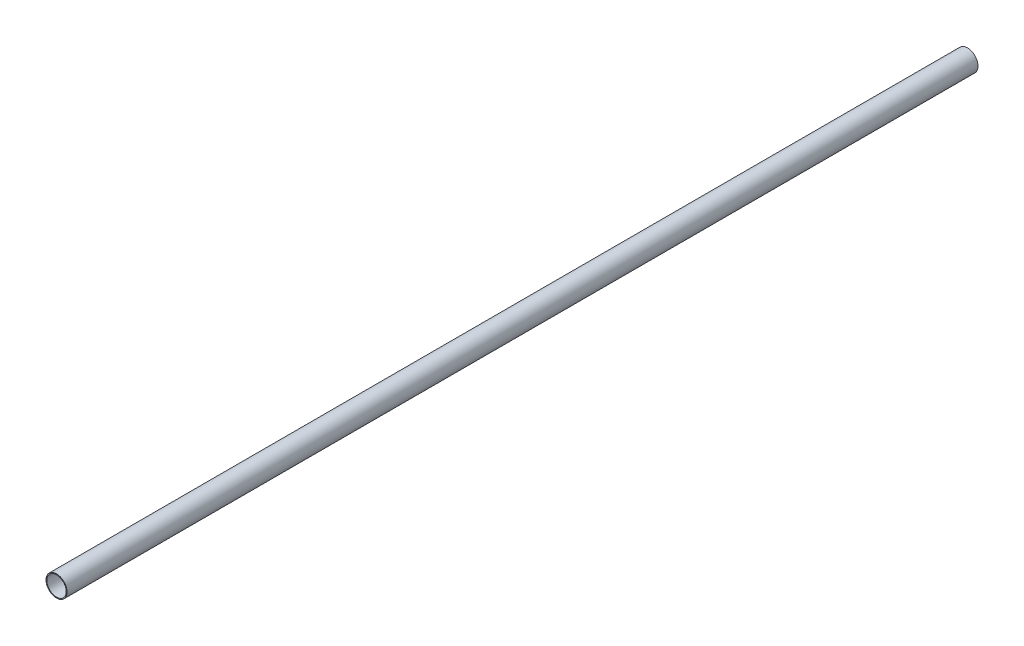
ISO-10303-21;
HEADER;
FILE_DESCRIPTION(('STEP AP214'),'2;1');
FILE_NAME('part.step','',(''),(''),'','','');
FILE_SCHEMA(('AUTOMOTIVE_DESIGN { 1 0 10303 214 1 1 1 1 }'));
ENDSEC;
DATA;
#1=APPLICATION_CONTEXT('core data for automotive mechanical design processes');
#2=APPLICATION_PROTOCOL_DEFINITION('international standard','automotive_design',2000,#1);
#3=PRODUCT_CONTEXT('',#1,'mechanical');
#4=PRODUCT('Part','Part','',(#3));
#5=PRODUCT_RELATED_PRODUCT_CATEGORY('part','',(#4));
#6=PRODUCT_DEFINITION_FORMATION('','',#4);
#7=PRODUCT_DEFINITION_CONTEXT('part definition',#1,'design');
#8=PRODUCT_DEFINITION('design','',#6,#7);
#9=PRODUCT_DEFINITION_SHAPE('','',#8);
#10=(LENGTH_UNIT() NAMED_UNIT(*) SI_UNIT(.MILLI.,.METRE.));
#11=(NAMED_UNIT(*) PLANE_ANGLE_UNIT() SI_UNIT($,.RADIAN.));
#12=(NAMED_UNIT(*) SI_UNIT($,.STERADIAN.) SOLID_ANGLE_UNIT());
#13=UNCERTAINTY_MEASURE_WITH_UNIT(LENGTH_MEASURE(1.E-05),#10,'distance_accuracy_value','');
#14=(GEOMETRIC_REPRESENTATION_CONTEXT(3) GLOBAL_UNCERTAINTY_ASSIGNED_CONTEXT((#13)) GLOBAL_UNIT_ASSIGNED_CONTEXT((#10,
#11,#12)) REPRESENTATION_CONTEXT('',''));
#15=CARTESIAN_POINT('',(0.,0.,0.));
#16=DIRECTION('',(0.,0.,1.));
#17=DIRECTION('',(1.,0.,0.));
#18=AXIS2_PLACEMENT_3D('',#15,#16,#17);
#19=CARTESIAN_POINT('',(0.,0.,1085.85));
#20=DIRECTION('',(0.,0.,1.));
#21=DIRECTION('',(1.,0.,0.));
#22=AXIS2_PLACEMENT_3D('',#19,#20,#21);
#23=PLANE('',#22);
#24=CARTESIAN_POINT('',(0.,0.,1085.85));
#25=DIRECTION('',(0.,0.,1.));
#26=DIRECTION('',(1.,0.,0.));
#27=AXIS2_PLACEMENT_3D('',#24,#25,#26);
#28=CIRCLE('',#27,12.5603);
#29=CARTESIAN_POINT('',(12.5603,0.,1085.85));
#30=VERTEX_POINT('',#29);
#31=EDGE_CURVE('E10',#30,#30,#28,.T.);
#32=ORIENTED_EDGE('',*,*,#31,.T.);
#33=EDGE_LOOP('',(#32));
#34=FACE_BOUND('',#33,.T.);
#35=CARTESIAN_POINT('',(0.,0.,1085.85));
#36=DIRECTION('',(0.,0.,1.));
#37=DIRECTION('',(1.,0.,0.));
#38=AXIS2_PLACEMENT_3D('',#35,#36,#37);
#39=CIRCLE('',#38,11.5443);
#40=CARTESIAN_POINT('',(11.5443,0.,1085.85));
#41=VERTEX_POINT('',#40);
#42=EDGE_CURVE('E47',#41,#41,#39,.T.);
#43=ORIENTED_EDGE('',*,*,#42,.F.);
#44=EDGE_LOOP('',(#43));
#45=FACE_BOUND('',#44,.T.);
#46=ADVANCED_FACE('F36',(#34,#45),#23,.T.);
#47=CARTESIAN_POINT('',(0.,0.,0.));
#48=DIRECTION('',(0.,0.,1.));
#49=DIRECTION('',(1.,0.,0.));
#50=AXIS2_PLACEMENT_3D('',#47,#48,#49);
#51=PLANE('',#50);
#52=CARTESIAN_POINT('',(0.,0.,0.));
#53=DIRECTION('',(0.,0.,1.));
#54=DIRECTION('',(1.,0.,0.));
#55=AXIS2_PLACEMENT_3D('',#52,#53,#54);
#56=CIRCLE('',#55,12.5603);
#57=CARTESIAN_POINT('',(12.5603,0.,0.));
#58=VERTEX_POINT('',#57);
#59=EDGE_CURVE('E40',#58,#58,#56,.T.);
#60=ORIENTED_EDGE('',*,*,#59,.F.);
#61=EDGE_LOOP('',(#60));
#62=FACE_BOUND('',#61,.T.);
#63=CARTESIAN_POINT('',(0.,0.,0.));
#64=DIRECTION('',(0.,0.,1.));
#65=DIRECTION('',(1.,0.,0.));
#66=AXIS2_PLACEMENT_3D('',#63,#64,#65);
#67=CIRCLE('',#66,11.5443);
#68=CARTESIAN_POINT('',(11.5443,0.,0.));
#69=VERTEX_POINT('',#68);
#70=EDGE_CURVE('E49',#69,#69,#67,.T.);
#71=ORIENTED_EDGE('',*,*,#70,.T.);
#72=EDGE_LOOP('',(#71));
#73=FACE_BOUND('',#72,.T.);
#74=ADVANCED_FACE('F59',(#62,#73),#51,.F.);
#75=CARTESIAN_POINT('',(0.,0.,1085.85));
#76=DIRECTION('',(0.,0.,-1.));
#77=DIRECTION('',(-1.,0.,0.));
#78=AXIS2_PLACEMENT_3D('',#75,#76,#77);
#79=CYLINDRICAL_SURFACE('',#78,12.5603);
#80=ORIENTED_EDGE('',*,*,#31,.F.);
#81=EDGE_LOOP('',(#80));
#82=FACE_BOUND('',#81,.T.);
#83=ORIENTED_EDGE('',*,*,#59,.T.);
#84=EDGE_LOOP('',(#83));
#85=FACE_BOUND('',#84,.T.);
#86=ADVANCED_FACE('F38',(#82,#85),#79,.T.);
#87=CARTESIAN_POINT('',(0.,0.,1085.85));
#88=DIRECTION('',(0.,0.,-1.));
#89=DIRECTION('',(-1.,0.,0.));
#90=AXIS2_PLACEMENT_3D('',#87,#88,#89);
#91=CYLINDRICAL_SURFACE('',#90,11.5443);
#92=ORIENTED_EDGE('',*,*,#42,.T.);
#93=EDGE_LOOP('',(#92));
#94=FACE_BOUND('',#93,.T.);
#95=ORIENTED_EDGE('',*,*,#70,.F.);
#96=EDGE_LOOP('',(#95));
#97=FACE_BOUND('',#96,.T.);
#98=ADVANCED_FACE('F55',(#94,#97),#91,.F.);
#99=CLOSED_SHELL('',(#46,#74,#86,#98));
#100=MANIFOLD_SOLID_BREP('B2',#99);
#101=ADVANCED_BREP_SHAPE_REPRESENTATION('',(#18,#100),#14);
#102=SHAPE_DEFINITION_REPRESENTATION(#9,#101);
ENDSEC;
END-ISO-10303-21;
